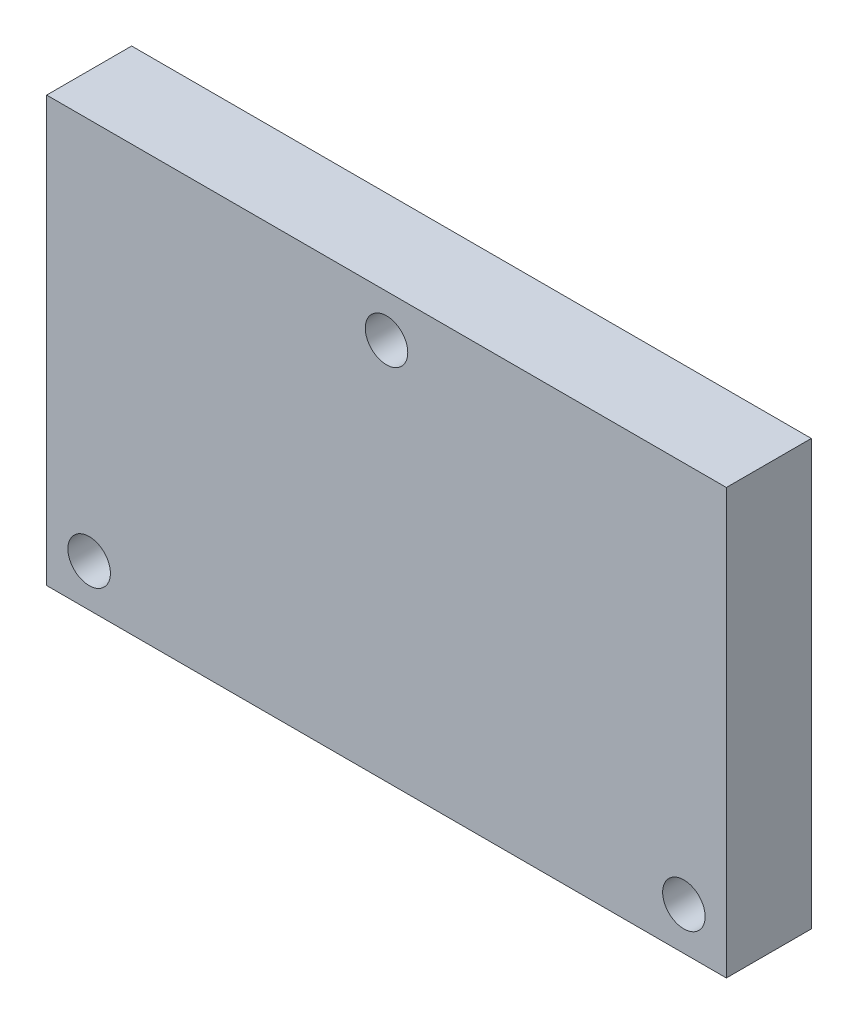
ISO-10303-21;
HEADER;
FILE_DESCRIPTION(('STEP AP214'),'2;1');
FILE_NAME('part.step','',(''),(''),'','','');
FILE_SCHEMA(('AUTOMOTIVE_DESIGN { 1 0 10303 214 1 1 1 1 }'));
ENDSEC;
DATA;
#1=APPLICATION_CONTEXT('core data for automotive mechanical design processes');
#2=APPLICATION_PROTOCOL_DEFINITION('international standard','automotive_design',2000,#1);
#3=PRODUCT_CONTEXT('',#1,'mechanical');
#4=PRODUCT('Part','Part','',(#3));
#5=PRODUCT_RELATED_PRODUCT_CATEGORY('part','',(#4));
#6=PRODUCT_DEFINITION_FORMATION('','',#4);
#7=PRODUCT_DEFINITION_CONTEXT('part definition',#1,'design');
#8=PRODUCT_DEFINITION('design','',#6,#7);
#9=PRODUCT_DEFINITION_SHAPE('','',#8);
#10=(LENGTH_UNIT() NAMED_UNIT(*) SI_UNIT(.MILLI.,.METRE.));
#11=(NAMED_UNIT(*) PLANE_ANGLE_UNIT() SI_UNIT($,.RADIAN.));
#12=(NAMED_UNIT(*) SI_UNIT($,.STERADIAN.) SOLID_ANGLE_UNIT());
#13=UNCERTAINTY_MEASURE_WITH_UNIT(LENGTH_MEASURE(1.E-05),#10,'distance_accuracy_value','');
#14=(GEOMETRIC_REPRESENTATION_CONTEXT(3) GLOBAL_UNCERTAINTY_ASSIGNED_CONTEXT((#13)) GLOBAL_UNIT_ASSIGNED_CONTEXT((#10,
#11,#12)) REPRESENTATION_CONTEXT('',''));
#15=CARTESIAN_POINT('',(0.,0.,0.));
#16=DIRECTION('',(0.,0.,1.));
#17=DIRECTION('',(1.,0.,0.));
#18=AXIS2_PLACEMENT_3D('',#15,#16,#17);
#19=CARTESIAN_POINT('',(0.,0.,6.));
#20=DIRECTION('',(0.,0.,-1.));
#21=DIRECTION('',(-1.,0.,0.));
#22=AXIS2_PLACEMENT_3D('',#19,#20,#21);
#23=PLANE('',#22);
#24=DIRECTION('',(-1.,0.,0.));
#25=VECTOR('',#24,1.);
#26=CARTESIAN_POINT('',(-68.2499999999981,-336.,6.));
#27=LINE('',#26,#25);
#28=CARTESIAN_POINT('',(-20.2500000000057,-336.,6.));
#29=VERTEX_POINT('',#28);
#30=CARTESIAN_POINT('',(-68.2499999999981,-336.,6.));
#31=VERTEX_POINT('',#30);
#32=EDGE_CURVE('E86',#29,#31,#27,.T.);
#33=ORIENTED_EDGE('',*,*,#32,.T.);
#34=DIRECTION('',(0.,-1.,0.));
#35=VECTOR('',#34,1.);
#36=CARTESIAN_POINT('',(-68.2499999999981,-336.,6.));
#37=LINE('',#36,#35);
#38=CARTESIAN_POINT('',(-68.2499999999981,-366.,6.));
#39=VERTEX_POINT('',#38);
#40=EDGE_CURVE('E81',#31,#39,#37,.T.);
#41=ORIENTED_EDGE('',*,*,#40,.T.);
#42=DIRECTION('',(1.,0.,0.));
#43=VECTOR('',#42,1.);
#44=CARTESIAN_POINT('',(-68.2499999999981,-366.,6.));
#45=LINE('',#44,#43);
#46=CARTESIAN_POINT('',(-20.2500000000057,-366.,6.));
#47=VERTEX_POINT('',#46);
#48=EDGE_CURVE('E84',#39,#47,#45,.T.);
#49=ORIENTED_EDGE('',*,*,#48,.T.);
#50=DIRECTION('',(0.,1.,0.));
#51=VECTOR('',#50,1.);
#52=CARTESIAN_POINT('',(-20.2500000000057,-336.,6.));
#53=LINE('',#52,#51);
#54=EDGE_CURVE('E51',#47,#29,#53,.T.);
#55=ORIENTED_EDGE('',*,*,#54,.T.);
#56=EDGE_LOOP('',(#33,#41,#49,#55));
#57=FACE_BOUND('',#56,.T.);
#58=CARTESIAN_POINT('',(-65.2499999999981,-363.,6.));
#59=DIRECTION('',(0.,0.,1.));
#60=DIRECTION('',(1.,0.,0.));
#61=AXIS2_PLACEMENT_3D('',#58,#59,#60);
#62=CIRCLE('',#61,1.5);
#63=CARTESIAN_POINT('',(-63.7499999999981,-363.,6.));
#64=VERTEX_POINT('',#63);
#65=EDGE_CURVE('E101',#64,#64,#62,.T.);
#66=ORIENTED_EDGE('',*,*,#65,.F.);
#67=EDGE_LOOP('',(#66));
#68=FACE_BOUND('',#67,.T.);
#69=CARTESIAN_POINT('',(-23.2499999999981,-363.,6.));
#70=DIRECTION('',(0.,0.,1.));
#71=DIRECTION('',(1.,0.,0.));
#72=AXIS2_PLACEMENT_3D('',#69,#70,#71);
#73=CIRCLE('',#72,1.5);
#74=CARTESIAN_POINT('',(-21.7499999999981,-363.,6.));
#75=VERTEX_POINT('',#74);
#76=EDGE_CURVE('E116',#75,#75,#73,.T.);
#77=ORIENTED_EDGE('',*,*,#76,.F.);
#78=EDGE_LOOP('',(#77));
#79=FACE_BOUND('',#78,.T.);
#80=CARTESIAN_POINT('',(-44.2500000000019,-339.,6.));
#81=DIRECTION('',(0.,0.,1.));
#82=DIRECTION('',(1.,0.,0.));
#83=AXIS2_PLACEMENT_3D('',#80,#81,#82);
#84=CIRCLE('',#83,1.5);
#85=CARTESIAN_POINT('',(-42.7500000000019,-339.,6.));
#86=VERTEX_POINT('',#85);
#87=EDGE_CURVE('E122',#86,#86,#84,.T.);
#88=ORIENTED_EDGE('',*,*,#87,.F.);
#89=EDGE_LOOP('',(#88));
#90=FACE_BOUND('',#89,.T.);
#91=ADVANCED_FACE('F34',(#57,#68,#79,#90),#23,.F.);
#92=CARTESIAN_POINT('',(0.,0.,0.));
#93=DIRECTION('',(0.,0.,-1.));
#94=DIRECTION('',(-1.,0.,0.));
#95=AXIS2_PLACEMENT_3D('',#92,#93,#94);
#96=PLANE('',#95);
#97=CARTESIAN_POINT('',(-23.2499999999981,-363.,0.));
#98=DIRECTION('',(0.,0.,1.));
#99=DIRECTION('',(1.,0.,0.));
#100=AXIS2_PLACEMENT_3D('',#97,#98,#99);
#101=CIRCLE('',#100,1.5);
#102=CARTESIAN_POINT('',(-21.7499999999981,-363.,0.));
#103=VERTEX_POINT('',#102);
#104=EDGE_CURVE('E119',#103,#103,#101,.T.);
#105=ORIENTED_EDGE('',*,*,#104,.T.);
#106=EDGE_LOOP('',(#105));
#107=FACE_BOUND('',#106,.T.);
#108=DIRECTION('',(-1.,0.,0.));
#109=VECTOR('',#108,1.);
#110=CARTESIAN_POINT('',(-68.2499999999981,-336.,0.));
#111=LINE('',#110,#109);
#112=CARTESIAN_POINT('',(-20.2500000000057,-336.,0.));
#113=VERTEX_POINT('',#112);
#114=CARTESIAN_POINT('',(-68.2499999999981,-336.,0.));
#115=VERTEX_POINT('',#114);
#116=EDGE_CURVE('E98',#113,#115,#111,.T.);
#117=ORIENTED_EDGE('',*,*,#116,.F.);
#118=DIRECTION('',(0.,1.,0.));
#119=VECTOR('',#118,1.);
#120=CARTESIAN_POINT('',(-20.2500000000057,-336.,0.));
#121=LINE('',#120,#119);
#122=CARTESIAN_POINT('',(-20.2500000000057,-366.,0.));
#123=VERTEX_POINT('',#122);
#124=EDGE_CURVE('E74',#123,#113,#121,.T.);
#125=ORIENTED_EDGE('',*,*,#124,.F.);
#126=DIRECTION('',(1.,0.,0.));
#127=VECTOR('',#126,1.);
#128=CARTESIAN_POINT('',(-68.2499999999981,-366.,0.));
#129=LINE('',#128,#127);
#130=CARTESIAN_POINT('',(-68.2499999999981,-366.,0.));
#131=VERTEX_POINT('',#130);
#132=EDGE_CURVE('E68',#131,#123,#129,.T.);
#133=ORIENTED_EDGE('',*,*,#132,.F.);
#134=DIRECTION('',(0.,-1.,0.));
#135=VECTOR('',#134,1.);
#136=CARTESIAN_POINT('',(-68.2499999999981,-336.,0.));
#137=LINE('',#136,#135);
#138=EDGE_CURVE('E90',#115,#131,#137,.T.);
#139=ORIENTED_EDGE('',*,*,#138,.F.);
#140=EDGE_LOOP('',(#117,#125,#133,#139));
#141=FACE_BOUND('',#140,.T.);
#142=CARTESIAN_POINT('',(-65.2499999999981,-363.,0.));
#143=DIRECTION('',(0.,0.,1.));
#144=DIRECTION('',(1.,0.,0.));
#145=AXIS2_PLACEMENT_3D('',#142,#143,#144);
#146=CIRCLE('',#145,1.5);
#147=CARTESIAN_POINT('',(-63.7499999999981,-363.,0.));
#148=VERTEX_POINT('',#147);
#149=EDGE_CURVE('E113',#148,#148,#146,.T.);
#150=ORIENTED_EDGE('',*,*,#149,.T.);
#151=EDGE_LOOP('',(#150));
#152=FACE_BOUND('',#151,.T.);
#153=CARTESIAN_POINT('',(-44.2500000000019,-339.,0.));
#154=DIRECTION('',(0.,0.,1.));
#155=DIRECTION('',(1.,0.,0.));
#156=AXIS2_PLACEMENT_3D('',#153,#154,#155);
#157=CIRCLE('',#156,1.5);
#158=CARTESIAN_POINT('',(-42.7500000000019,-339.,0.));
#159=VERTEX_POINT('',#158);
#160=EDGE_CURVE('E125',#159,#159,#157,.T.);
#161=ORIENTED_EDGE('',*,*,#160,.T.);
#162=EDGE_LOOP('',(#161));
#163=FACE_BOUND('',#162,.T.);
#164=ADVANCED_FACE('F109',(#107,#141,#152,#163),#96,.T.);
#165=CARTESIAN_POINT('',(-68.2499999999981,-336.,6.));
#166=DIRECTION('',(0.,-1.,0.));
#167=DIRECTION('',(0.,0.,-1.));
#168=AXIS2_PLACEMENT_3D('',#165,#166,#167);
#169=PLANE('',#168);
#170=ORIENTED_EDGE('',*,*,#116,.T.);
#171=DIRECTION('',(0.,0.,-1.));
#172=VECTOR('',#171,1.);
#173=CARTESIAN_POINT('',(-68.2499999999981,-336.,6.));
#174=LINE('',#173,#172);
#175=EDGE_CURVE('E11',#31,#115,#174,.T.);
#176=ORIENTED_EDGE('',*,*,#175,.F.);
#177=ORIENTED_EDGE('',*,*,#32,.F.);
#178=DIRECTION('',(0.,0.,-1.));
#179=VECTOR('',#178,1.);
#180=CARTESIAN_POINT('',(-20.2500000000057,-336.,6.));
#181=LINE('',#180,#179);
#182=EDGE_CURVE('E94',#29,#113,#181,.T.);
#183=ORIENTED_EDGE('',*,*,#182,.T.);
#184=EDGE_LOOP('',(#170,#176,#177,#183));
#185=FACE_BOUND('',#184,.T.);
#186=ADVANCED_FACE('F36',(#185),#169,.F.);
#187=CARTESIAN_POINT('',(-68.2499999999981,-336.,6.));
#188=DIRECTION('',(1.,0.,0.));
#189=DIRECTION('',(0.,0.,-1.));
#190=AXIS2_PLACEMENT_3D('',#187,#188,#189);
#191=PLANE('',#190);
#192=ORIENTED_EDGE('',*,*,#138,.T.);
#193=DIRECTION('',(0.,0.,-1.));
#194=VECTOR('',#193,1.);
#195=CARTESIAN_POINT('',(-68.2499999999981,-366.,6.));
#196=LINE('',#195,#194);
#197=EDGE_CURVE('E43',#39,#131,#196,.T.);
#198=ORIENTED_EDGE('',*,*,#197,.F.);
#199=ORIENTED_EDGE('',*,*,#40,.F.);
#200=ORIENTED_EDGE('',*,*,#175,.T.);
#201=EDGE_LOOP('',(#192,#198,#199,#200));
#202=FACE_BOUND('',#201,.T.);
#203=ADVANCED_FACE('F89',(#202),#191,.F.);
#204=CARTESIAN_POINT('',(-68.2499999999981,-366.,6.));
#205=DIRECTION('',(0.,1.,0.));
#206=DIRECTION('',(0.,0.,1.));
#207=AXIS2_PLACEMENT_3D('',#204,#205,#206);
#208=PLANE('',#207);
#209=ORIENTED_EDGE('',*,*,#132,.T.);
#210=DIRECTION('',(0.,0.,-1.));
#211=VECTOR('',#210,1.);
#212=CARTESIAN_POINT('',(-20.2500000000057,-366.,6.));
#213=LINE('',#212,#211);
#214=EDGE_CURVE('E91',#47,#123,#213,.T.);
#215=ORIENTED_EDGE('',*,*,#214,.F.);
#216=ORIENTED_EDGE('',*,*,#48,.F.);
#217=ORIENTED_EDGE('',*,*,#197,.T.);
#218=EDGE_LOOP('',(#209,#215,#216,#217));
#219=FACE_BOUND('',#218,.T.);
#220=ADVANCED_FACE('F92',(#219),#208,.F.);
#221=CARTESIAN_POINT('',(-20.2500000000057,-336.,6.));
#222=DIRECTION('',(-1.,0.,0.));
#223=DIRECTION('',(0.,-1.,0.));
#224=AXIS2_PLACEMENT_3D('',#221,#222,#223);
#225=PLANE('',#224);
#226=ORIENTED_EDGE('',*,*,#124,.T.);
#227=ORIENTED_EDGE('',*,*,#182,.F.);
#228=ORIENTED_EDGE('',*,*,#54,.F.);
#229=ORIENTED_EDGE('',*,*,#214,.T.);
#230=EDGE_LOOP('',(#226,#227,#228,#229));
#231=FACE_BOUND('',#230,.T.);
#232=ADVANCED_FACE('F106',(#231),#225,.F.);
#233=CARTESIAN_POINT('',(-65.2499999999981,-363.,6.));
#234=DIRECTION('',(0.,0.,-1.));
#235=DIRECTION('',(-1.,0.,0.));
#236=AXIS2_PLACEMENT_3D('',#233,#234,#235);
#237=CYLINDRICAL_SURFACE('',#236,1.5);
#238=ORIENTED_EDGE('',*,*,#65,.T.);
#239=EDGE_LOOP('',(#238));
#240=FACE_BOUND('',#239,.T.);
#241=ORIENTED_EDGE('',*,*,#149,.F.);
#242=EDGE_LOOP('',(#241));
#243=FACE_BOUND('',#242,.T.);
#244=ADVANCED_FACE('F142',(#240,#243),#237,.F.);
#245=CARTESIAN_POINT('',(-23.2499999999981,-363.,6.));
#246=DIRECTION('',(0.,0.,-1.));
#247=DIRECTION('',(-1.,0.,0.));
#248=AXIS2_PLACEMENT_3D('',#245,#246,#247);
#249=CYLINDRICAL_SURFACE('',#248,1.5);
#250=ORIENTED_EDGE('',*,*,#76,.T.);
#251=EDGE_LOOP('',(#250));
#252=FACE_BOUND('',#251,.T.);
#253=ORIENTED_EDGE('',*,*,#104,.F.);
#254=EDGE_LOOP('',(#253));
#255=FACE_BOUND('',#254,.T.);
#256=ADVANCED_FACE('F188',(#252,#255),#249,.F.);
#257=CARTESIAN_POINT('',(-44.2500000000019,-339.,6.));
#258=DIRECTION('',(0.,0.,-1.));
#259=DIRECTION('',(-1.,0.,0.));
#260=AXIS2_PLACEMENT_3D('',#257,#258,#259);
#261=CYLINDRICAL_SURFACE('',#260,1.5);
#262=ORIENTED_EDGE('',*,*,#87,.T.);
#263=EDGE_LOOP('',(#262));
#264=FACE_BOUND('',#263,.T.);
#265=ORIENTED_EDGE('',*,*,#160,.F.);
#266=EDGE_LOOP('',(#265));
#267=FACE_BOUND('',#266,.T.);
#268=ADVANCED_FACE('F131',(#264,#267),#261,.F.);
#269=CLOSED_SHELL('',(#91,#164,#186,#203,#220,#232,#244,#256,#268));
#270=MANIFOLD_SOLID_BREP('B2',#269);
#271=ADVANCED_BREP_SHAPE_REPRESENTATION('',(#18,#270),#14);
#272=SHAPE_DEFINITION_REPRESENTATION(#9,#271);
ENDSEC;
END-ISO-10303-21;
